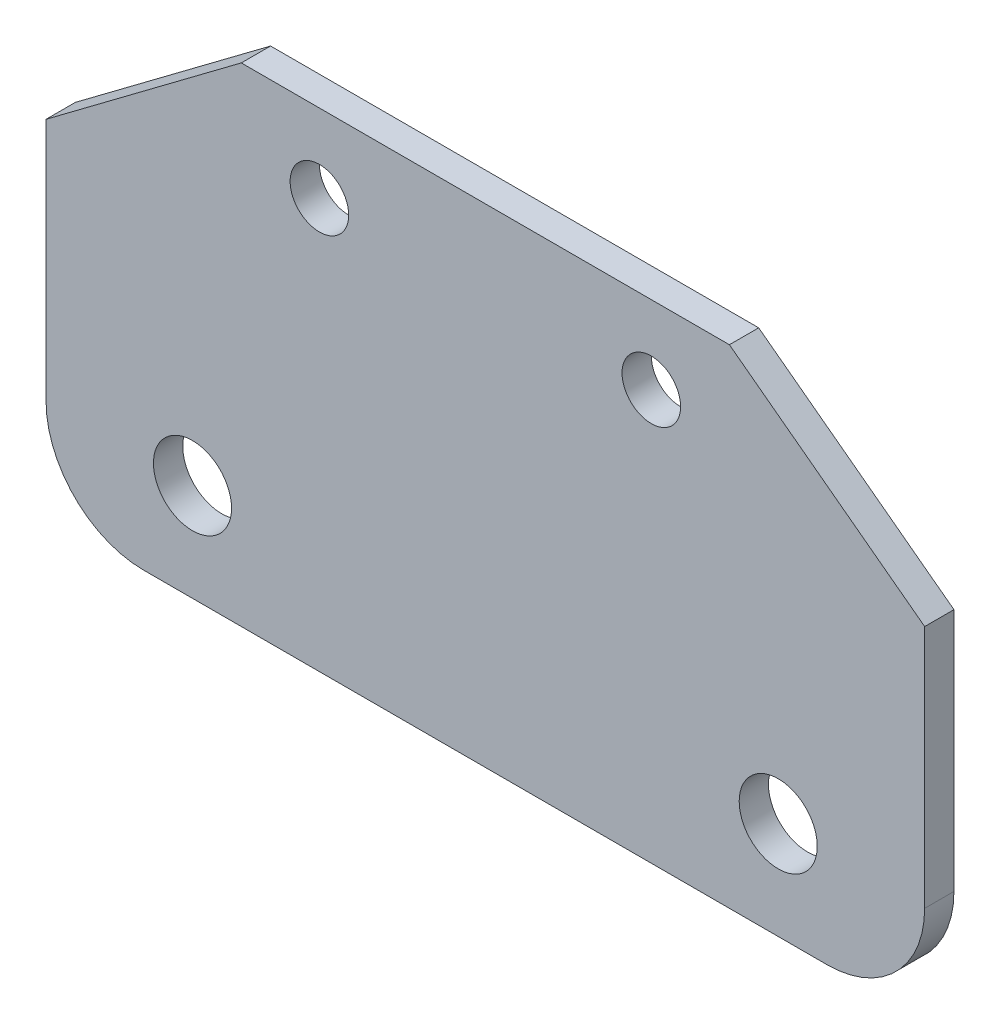
ISO-10303-21;
HEADER;
FILE_DESCRIPTION(('STEP AP214'),'2;1');
FILE_NAME('part.step','',(''),(''),'','','');
FILE_SCHEMA(('AUTOMOTIVE_DESIGN { 1 0 10303 214 1 1 1 1 }'));
ENDSEC;
DATA;
#1=APPLICATION_CONTEXT('core data for automotive mechanical design processes');
#2=APPLICATION_PROTOCOL_DEFINITION('international standard','automotive_design',2000,#1);
#3=PRODUCT_CONTEXT('',#1,'mechanical');
#4=PRODUCT('Part','Part','',(#3));
#5=PRODUCT_RELATED_PRODUCT_CATEGORY('part','',(#4));
#6=PRODUCT_DEFINITION_FORMATION('','',#4);
#7=PRODUCT_DEFINITION_CONTEXT('part definition',#1,'design');
#8=PRODUCT_DEFINITION('design','',#6,#7);
#9=PRODUCT_DEFINITION_SHAPE('','',#8);
#10=(LENGTH_UNIT() NAMED_UNIT(*) SI_UNIT(.MILLI.,.METRE.));
#11=(NAMED_UNIT(*) PLANE_ANGLE_UNIT() SI_UNIT($,.RADIAN.));
#12=(NAMED_UNIT(*) SI_UNIT($,.STERADIAN.) SOLID_ANGLE_UNIT());
#13=UNCERTAINTY_MEASURE_WITH_UNIT(LENGTH_MEASURE(1.E-05),#10,'distance_accuracy_value','');
#14=(GEOMETRIC_REPRESENTATION_CONTEXT(3) GLOBAL_UNCERTAINTY_ASSIGNED_CONTEXT((#13)) GLOBAL_UNIT_ASSIGNED_CONTEXT((#10,
#11,#12)) REPRESENTATION_CONTEXT('',''));
#15=CARTESIAN_POINT('',(0.,0.,0.));
#16=DIRECTION('',(0.,0.,1.));
#17=DIRECTION('',(1.,0.,0.));
#18=AXIS2_PLACEMENT_3D('',#15,#16,#17);
#19=CARTESIAN_POINT('',(0.,0.,3.));
#20=DIRECTION('',(0.,0.,-1.));
#21=DIRECTION('',(-1.,0.,0.));
#22=AXIS2_PLACEMENT_3D('',#19,#20,#21);
#23=PLANE('',#22);
#24=DIRECTION('',(0.,-1.,0.));
#25=VECTOR('',#24,1.);
#26=CARTESIAN_POINT('',(0.,0.,3.));
#27=LINE('',#26,#25);
#28=CARTESIAN_POINT('',(0.,35.,3.));
#29=VERTEX_POINT('',#28);
#30=CARTESIAN_POINT('',(0.,10.,3.));
#31=VERTEX_POINT('',#30);
#32=EDGE_CURVE('E147',#29,#31,#27,.T.);
#33=ORIENTED_EDGE('',*,*,#32,.T.);
#34=CARTESIAN_POINT('',(10.,10.,3.));
#35=DIRECTION('',(0.,0.,-1.));
#36=DIRECTION('',(-1.,0.,0.));
#37=AXIS2_PLACEMENT_3D('',#34,#35,#36);
#38=CIRCLE('',#37,10.);
#39=CARTESIAN_POINT('',(10.,0.,3.));
#40=VERTEX_POINT('',#39);
#41=EDGE_CURVE('E46',#31,#40,#38,.F.);
#42=ORIENTED_EDGE('',*,*,#41,.T.);
#43=DIRECTION('',(1.,0.,0.));
#44=VECTOR('',#43,1.);
#45=CARTESIAN_POINT('',(0.,0.,3.));
#46=LINE('',#45,#44);
#47=CARTESIAN_POINT('',(80.,0.,3.));
#48=VERTEX_POINT('',#47);
#49=EDGE_CURVE('E111',#40,#48,#46,.T.);
#50=ORIENTED_EDGE('',*,*,#49,.T.);
#51=CARTESIAN_POINT('',(80.,10.,3.));
#52=DIRECTION('',(0.,0.,-1.));
#53=DIRECTION('',(-1.,0.,0.));
#54=AXIS2_PLACEMENT_3D('',#51,#52,#53);
#55=CIRCLE('',#54,10.);
#56=CARTESIAN_POINT('',(90.,10.,3.));
#57=VERTEX_POINT('',#56);
#58=EDGE_CURVE('E53',#48,#57,#55,.F.);
#59=ORIENTED_EDGE('',*,*,#58,.T.);
#60=DIRECTION('',(0.,1.,0.));
#61=VECTOR('',#60,1.);
#62=CARTESIAN_POINT('',(90.,0.,3.));
#63=LINE('',#62,#61);
#64=CARTESIAN_POINT('',(90.,35.,3.));
#65=VERTEX_POINT('',#64);
#66=EDGE_CURVE('E103',#57,#65,#63,.T.);
#67=ORIENTED_EDGE('',*,*,#66,.T.);
#68=DIRECTION('',(-0.8,0.6,0.));
#69=VECTOR('',#68,1.);
#70=CARTESIAN_POINT('',(90.,35.,3.));
#71=LINE('',#70,#69);
#72=CARTESIAN_POINT('',(70.,50.,3.));
#73=VERTEX_POINT('',#72);
#74=EDGE_CURVE('E107',#65,#73,#71,.T.);
#75=ORIENTED_EDGE('',*,*,#74,.T.);
#76=DIRECTION('',(-1.,0.,0.));
#77=VECTOR('',#76,1.);
#78=CARTESIAN_POINT('',(20.,50.,3.));
#79=LINE('',#78,#77);
#80=CARTESIAN_POINT('',(20.,50.,3.));
#81=VERTEX_POINT('',#80);
#82=EDGE_CURVE('E126',#73,#81,#79,.T.);
#83=ORIENTED_EDGE('',*,*,#82,.T.);
#84=DIRECTION('',(-0.8,-0.6,0.));
#85=VECTOR('',#84,1.);
#86=CARTESIAN_POINT('',(0.,35.,3.));
#87=LINE('',#86,#85);
#88=EDGE_CURVE('E128',#81,#29,#87,.T.);
#89=ORIENTED_EDGE('',*,*,#88,.T.);
#90=EDGE_LOOP('',(#33,#42,#50,#59,#67,#75,#83,#89));
#91=FACE_BOUND('',#90,.T.);
#92=CARTESIAN_POINT('',(28.,42.,3.));
#93=DIRECTION('',(0.,0.,1.));
#94=DIRECTION('',(1.,0.,0.));
#95=AXIS2_PLACEMENT_3D('',#92,#93,#94);
#96=CIRCLE('',#95,3.);
#97=CARTESIAN_POINT('',(31.,42.,3.));
#98=VERTEX_POINT('',#97);
#99=EDGE_CURVE('E137',#98,#98,#96,.T.);
#100=ORIENTED_EDGE('',*,*,#99,.F.);
#101=EDGE_LOOP('',(#100));
#102=FACE_BOUND('',#101,.T.);
#103=CARTESIAN_POINT('',(15.,10.,3.));
#104=DIRECTION('',(0.,0.,1.));
#105=DIRECTION('',(1.,0.,0.));
#106=AXIS2_PLACEMENT_3D('',#103,#104,#105);
#107=CIRCLE('',#106,4.);
#108=CARTESIAN_POINT('',(19.,10.,3.));
#109=VERTEX_POINT('',#108);
#110=EDGE_CURVE('E238',#109,#109,#107,.T.);
#111=ORIENTED_EDGE('',*,*,#110,.F.);
#112=EDGE_LOOP('',(#111));
#113=FACE_BOUND('',#112,.T.);
#114=CARTESIAN_POINT('',(75.,10.,3.));
#115=DIRECTION('',(0.,0.,1.));
#116=DIRECTION('',(-1.,0.,0.));
#117=AXIS2_PLACEMENT_3D('',#114,#115,#116);
#118=CIRCLE('',#117,4.00000000000001);
#119=CARTESIAN_POINT('',(71.,10.,3.));
#120=VERTEX_POINT('',#119);
#121=EDGE_CURVE('E232',#120,#120,#118,.T.);
#122=ORIENTED_EDGE('',*,*,#121,.F.);
#123=EDGE_LOOP('',(#122));
#124=FACE_BOUND('',#123,.T.);
#125=CARTESIAN_POINT('',(62.,42.,3.));
#126=DIRECTION('',(0.,0.,1.));
#127=DIRECTION('',(-1.,0.,0.));
#128=AXIS2_PLACEMENT_3D('',#125,#126,#127);
#129=CIRCLE('',#128,3.);
#130=CARTESIAN_POINT('',(59.,42.,3.));
#131=VERTEX_POINT('',#130);
#132=EDGE_CURVE('E223',#131,#131,#129,.T.);
#133=ORIENTED_EDGE('',*,*,#132,.F.);
#134=EDGE_LOOP('',(#133));
#135=FACE_BOUND('',#134,.T.);
#136=ADVANCED_FACE('F38',(#91,#102,#113,#124,#135),#23,.F.);
#137=CARTESIAN_POINT('',(0.,0.,0.));
#138=DIRECTION('',(0.,0.,-1.));
#139=DIRECTION('',(-1.,0.,0.));
#140=AXIS2_PLACEMENT_3D('',#137,#138,#139);
#141=PLANE('',#140);
#142=CARTESIAN_POINT('',(75.,10.,0.));
#143=DIRECTION('',(0.,0.,1.));
#144=DIRECTION('',(-1.,0.,0.));
#145=AXIS2_PLACEMENT_3D('',#142,#143,#144);
#146=CIRCLE('',#145,4.00000000000001);
#147=CARTESIAN_POINT('',(71.,10.,0.));
#148=VERTEX_POINT('',#147);
#149=EDGE_CURVE('E229',#148,#148,#146,.T.);
#150=ORIENTED_EDGE('',*,*,#149,.T.);
#151=EDGE_LOOP('',(#150));
#152=FACE_BOUND('',#151,.T.);
#153=CARTESIAN_POINT('',(28.,42.,0.));
#154=DIRECTION('',(0.,0.,1.));
#155=DIRECTION('',(1.,0.,0.));
#156=AXIS2_PLACEMENT_3D('',#153,#154,#155);
#157=CIRCLE('',#156,3.);
#158=CARTESIAN_POINT('',(31.,42.,0.));
#159=VERTEX_POINT('',#158);
#160=EDGE_CURVE('E241',#159,#159,#157,.T.);
#161=ORIENTED_EDGE('',*,*,#160,.T.);
#162=EDGE_LOOP('',(#161));
#163=FACE_BOUND('',#162,.T.);
#164=DIRECTION('',(1.,0.,0.));
#165=VECTOR('',#164,1.);
#166=CARTESIAN_POINT('',(0.,0.,0.));
#167=LINE('',#166,#165);
#168=CARTESIAN_POINT('',(10.,0.,0.));
#169=VERTEX_POINT('',#168);
#170=CARTESIAN_POINT('',(80.,0.,0.));
#171=VERTEX_POINT('',#170);
#172=EDGE_CURVE('E136',#169,#171,#167,.T.);
#173=ORIENTED_EDGE('',*,*,#172,.F.);
#174=CARTESIAN_POINT('',(10.,10.,0.));
#175=DIRECTION('',(0.,0.,-1.));
#176=DIRECTION('',(-1.,0.,0.));
#177=AXIS2_PLACEMENT_3D('',#174,#175,#176);
#178=CIRCLE('',#177,10.);
#179=CARTESIAN_POINT('',(0.,10.,0.));
#180=VERTEX_POINT('',#179);
#181=EDGE_CURVE('E160',#169,#180,#178,.T.);
#182=ORIENTED_EDGE('',*,*,#181,.T.);
#183=DIRECTION('',(0.,-1.,0.));
#184=VECTOR('',#183,1.);
#185=CARTESIAN_POINT('',(0.,0.,0.));
#186=LINE('',#185,#184);
#187=CARTESIAN_POINT('',(0.,35.,0.));
#188=VERTEX_POINT('',#187);
#189=EDGE_CURVE('E134',#188,#180,#186,.T.);
#190=ORIENTED_EDGE('',*,*,#189,.F.);
#191=DIRECTION('',(-0.8,-0.6,0.));
#192=VECTOR('',#191,1.);
#193=CARTESIAN_POINT('',(0.,35.,0.));
#194=LINE('',#193,#192);
#195=CARTESIAN_POINT('',(20.,50.,0.));
#196=VERTEX_POINT('',#195);
#197=EDGE_CURVE('E145',#196,#188,#194,.T.);
#198=ORIENTED_EDGE('',*,*,#197,.F.);
#199=DIRECTION('',(-1.,0.,0.));
#200=VECTOR('',#199,1.);
#201=CARTESIAN_POINT('',(20.,50.,0.));
#202=LINE('',#201,#200);
#203=CARTESIAN_POINT('',(70.,50.,0.));
#204=VERTEX_POINT('',#203);
#205=EDGE_CURVE('E143',#204,#196,#202,.T.);
#206=ORIENTED_EDGE('',*,*,#205,.F.);
#207=DIRECTION('',(-0.8,0.6,0.));
#208=VECTOR('',#207,1.);
#209=CARTESIAN_POINT('',(90.,35.,0.));
#210=LINE('',#209,#208);
#211=CARTESIAN_POINT('',(90.,35.,0.));
#212=VERTEX_POINT('',#211);
#213=EDGE_CURVE('E141',#212,#204,#210,.T.);
#214=ORIENTED_EDGE('',*,*,#213,.F.);
#215=DIRECTION('',(0.,1.,0.));
#216=VECTOR('',#215,1.);
#217=CARTESIAN_POINT('',(90.,0.,0.));
#218=LINE('',#217,#216);
#219=CARTESIAN_POINT('',(90.,10.,0.));
#220=VERTEX_POINT('',#219);
#221=EDGE_CURVE('E117',#220,#212,#218,.T.);
#222=ORIENTED_EDGE('',*,*,#221,.F.);
#223=CARTESIAN_POINT('',(80.,10.,0.));
#224=DIRECTION('',(0.,0.,-1.));
#225=DIRECTION('',(-1.,0.,0.));
#226=AXIS2_PLACEMENT_3D('',#223,#224,#225);
#227=CIRCLE('',#226,10.);
#228=EDGE_CURVE('E158',#220,#171,#227,.T.);
#229=ORIENTED_EDGE('',*,*,#228,.T.);
#230=EDGE_LOOP('',(#173,#182,#190,#198,#206,#214,#222,#229));
#231=FACE_BOUND('',#230,.T.);
#232=CARTESIAN_POINT('',(15.,10.,0.));
#233=DIRECTION('',(0.,0.,1.));
#234=DIRECTION('',(1.,0.,0.));
#235=AXIS2_PLACEMENT_3D('',#232,#233,#234);
#236=CIRCLE('',#235,4.);
#237=CARTESIAN_POINT('',(19.,10.,0.));
#238=VERTEX_POINT('',#237);
#239=EDGE_CURVE('E235',#238,#238,#236,.T.);
#240=ORIENTED_EDGE('',*,*,#239,.T.);
#241=EDGE_LOOP('',(#240));
#242=FACE_BOUND('',#241,.T.);
#243=CARTESIAN_POINT('',(62.,42.,0.));
#244=DIRECTION('',(0.,0.,1.));
#245=DIRECTION('',(-1.,0.,0.));
#246=AXIS2_PLACEMENT_3D('',#243,#244,#245);
#247=CIRCLE('',#246,3.);
#248=CARTESIAN_POINT('',(59.,42.,0.));
#249=VERTEX_POINT('',#248);
#250=EDGE_CURVE('E226',#249,#249,#247,.T.);
#251=ORIENTED_EDGE('',*,*,#250,.T.);
#252=EDGE_LOOP('',(#251));
#253=FACE_BOUND('',#252,.T.);
#254=ADVANCED_FACE('F174',(#152,#163,#231,#242,#253),#141,.T.);
#255=CARTESIAN_POINT('',(0.,0.,3.));
#256=DIRECTION('',(1.,0.,0.));
#257=DIRECTION('',(0.,0.,-1.));
#258=AXIS2_PLACEMENT_3D('',#255,#256,#257);
#259=PLANE('',#258);
#260=ORIENTED_EDGE('',*,*,#189,.T.);
#261=DIRECTION('',(0.,0.,-1.));
#262=VECTOR('',#261,1.);
#263=CARTESIAN_POINT('',(0.,10.,3.));
#264=LINE('',#263,#262);
#265=EDGE_CURVE('E61',#180,#31,#264,.F.);
#266=ORIENTED_EDGE('',*,*,#265,.T.);
#267=ORIENTED_EDGE('',*,*,#32,.F.);
#268=DIRECTION('',(0.,0.,-1.));
#269=VECTOR('',#268,1.);
#270=CARTESIAN_POINT('',(0.,35.,3.));
#271=LINE('',#270,#269);
#272=EDGE_CURVE('E133',#29,#188,#271,.T.);
#273=ORIENTED_EDGE('',*,*,#272,.T.);
#274=EDGE_LOOP('',(#260,#266,#267,#273));
#275=FACE_BOUND('',#274,.T.);
#276=ADVANCED_FACE('F177',(#275),#259,.F.);
#277=CARTESIAN_POINT('',(0.,0.,3.));
#278=DIRECTION('',(0.,1.,0.));
#279=DIRECTION('',(-1.,0.,0.));
#280=AXIS2_PLACEMENT_3D('',#277,#278,#279);
#281=PLANE('',#280);
#282=ORIENTED_EDGE('',*,*,#49,.F.);
#283=DIRECTION('',(0.,0.,-1.));
#284=VECTOR('',#283,1.);
#285=CARTESIAN_POINT('',(10.,0.,3.));
#286=LINE('',#285,#284);
#287=EDGE_CURVE('E155',#40,#169,#286,.T.);
#288=ORIENTED_EDGE('',*,*,#287,.T.);
#289=ORIENTED_EDGE('',*,*,#172,.T.);
#290=DIRECTION('',(0.,0.,-1.));
#291=VECTOR('',#290,1.);
#292=CARTESIAN_POINT('',(80.,0.,3.));
#293=LINE('',#292,#291);
#294=EDGE_CURVE('E120',#171,#48,#293,.F.);
#295=ORIENTED_EDGE('',*,*,#294,.T.);
#296=EDGE_LOOP('',(#282,#288,#289,#295));
#297=FACE_BOUND('',#296,.T.);
#298=ADVANCED_FACE('F168',(#297),#281,.F.);
#299=CARTESIAN_POINT('',(90.,0.,3.));
#300=DIRECTION('',(-1.,0.,0.));
#301=DIRECTION('',(0.,-1.,0.));
#302=AXIS2_PLACEMENT_3D('',#299,#300,#301);
#303=PLANE('',#302);
#304=ORIENTED_EDGE('',*,*,#66,.F.);
#305=DIRECTION('',(0.,0.,-1.));
#306=VECTOR('',#305,1.);
#307=CARTESIAN_POINT('',(90.,10.,3.));
#308=LINE('',#307,#306);
#309=EDGE_CURVE('E11',#57,#220,#308,.T.);
#310=ORIENTED_EDGE('',*,*,#309,.T.);
#311=ORIENTED_EDGE('',*,*,#221,.T.);
#312=DIRECTION('',(0.,0.,-1.));
#313=VECTOR('',#312,1.);
#314=CARTESIAN_POINT('',(90.,35.,3.));
#315=LINE('',#314,#313);
#316=EDGE_CURVE('E114',#65,#212,#315,.T.);
#317=ORIENTED_EDGE('',*,*,#316,.F.);
#318=EDGE_LOOP('',(#304,#310,#311,#317));
#319=FACE_BOUND('',#318,.T.);
#320=ADVANCED_FACE('F115',(#319),#303,.F.);
#321=CARTESIAN_POINT('',(90.,35.,3.));
#322=DIRECTION('',(-0.6,-0.8,0.));
#323=DIRECTION('',(0.8,-0.6,0.));
#324=AXIS2_PLACEMENT_3D('',#321,#322,#323);
#325=PLANE('',#324);
#326=ORIENTED_EDGE('',*,*,#213,.T.);
#327=DIRECTION('',(0.,0.,-1.));
#328=VECTOR('',#327,1.);
#329=CARTESIAN_POINT('',(70.,50.,3.));
#330=LINE('',#329,#328);
#331=EDGE_CURVE('E121',#73,#204,#330,.T.);
#332=ORIENTED_EDGE('',*,*,#331,.F.);
#333=ORIENTED_EDGE('',*,*,#74,.F.);
#334=ORIENTED_EDGE('',*,*,#316,.T.);
#335=EDGE_LOOP('',(#326,#332,#333,#334));
#336=FACE_BOUND('',#335,.T.);
#337=ADVANCED_FACE('F123',(#336),#325,.F.);
#338=CARTESIAN_POINT('',(20.,50.,3.));
#339=DIRECTION('',(0.,-1.,0.));
#340=DIRECTION('',(1.,0.,0.));
#341=AXIS2_PLACEMENT_3D('',#338,#339,#340);
#342=PLANE('',#341);
#343=ORIENTED_EDGE('',*,*,#205,.T.);
#344=DIRECTION('',(0.,0.,-1.));
#345=VECTOR('',#344,1.);
#346=CARTESIAN_POINT('',(20.,50.,3.));
#347=LINE('',#346,#345);
#348=EDGE_CURVE('E150',#81,#196,#347,.T.);
#349=ORIENTED_EDGE('',*,*,#348,.F.);
#350=ORIENTED_EDGE('',*,*,#82,.F.);
#351=ORIENTED_EDGE('',*,*,#331,.T.);
#352=EDGE_LOOP('',(#343,#349,#350,#351));
#353=FACE_BOUND('',#352,.T.);
#354=ADVANCED_FACE('F185',(#353),#342,.F.);
#355=CARTESIAN_POINT('',(0.,35.,3.));
#356=DIRECTION('',(0.6,-0.8,0.));
#357=DIRECTION('',(0.8,0.6,0.));
#358=AXIS2_PLACEMENT_3D('',#355,#356,#357);
#359=PLANE('',#358);
#360=ORIENTED_EDGE('',*,*,#197,.T.);
#361=ORIENTED_EDGE('',*,*,#272,.F.);
#362=ORIENTED_EDGE('',*,*,#88,.F.);
#363=ORIENTED_EDGE('',*,*,#348,.T.);
#364=EDGE_LOOP('',(#360,#361,#362,#363));
#365=FACE_BOUND('',#364,.T.);
#366=ADVANCED_FACE('F181',(#365),#359,.F.);
#367=CARTESIAN_POINT('',(28.,42.,3.));
#368=DIRECTION('',(0.,0.,-1.));
#369=DIRECTION('',(-1.,0.,0.));
#370=AXIS2_PLACEMENT_3D('',#367,#368,#369);
#371=CYLINDRICAL_SURFACE('',#370,3.);
#372=ORIENTED_EDGE('',*,*,#99,.T.);
#373=EDGE_LOOP('',(#372));
#374=FACE_BOUND('',#373,.T.);
#375=ORIENTED_EDGE('',*,*,#160,.F.);
#376=EDGE_LOOP('',(#375));
#377=FACE_BOUND('',#376,.T.);
#378=ADVANCED_FACE('F192',(#374,#377),#371,.F.);
#379=CARTESIAN_POINT('',(15.,10.,3.));
#380=DIRECTION('',(0.,0.,-1.));
#381=DIRECTION('',(-1.,0.,0.));
#382=AXIS2_PLACEMENT_3D('',#379,#380,#381);
#383=CYLINDRICAL_SURFACE('',#382,4.);
#384=ORIENTED_EDGE('',*,*,#110,.T.);
#385=EDGE_LOOP('',(#384));
#386=FACE_BOUND('',#385,.T.);
#387=ORIENTED_EDGE('',*,*,#239,.F.);
#388=EDGE_LOOP('',(#387));
#389=FACE_BOUND('',#388,.T.);
#390=ADVANCED_FACE('F205',(#386,#389),#383,.F.);
#391=CARTESIAN_POINT('',(75.,10.,3.));
#392=DIRECTION('',(0.,0.,-1.));
#393=DIRECTION('',(-1.,0.,0.));
#394=AXIS2_PLACEMENT_3D('',#391,#392,#393);
#395=CYLINDRICAL_SURFACE('',#394,4.00000000000001);
#396=ORIENTED_EDGE('',*,*,#121,.T.);
#397=EDGE_LOOP('',(#396));
#398=FACE_BOUND('',#397,.T.);
#399=ORIENTED_EDGE('',*,*,#149,.F.);
#400=EDGE_LOOP('',(#399));
#401=FACE_BOUND('',#400,.T.);
#402=ADVANCED_FACE('F209',(#398,#401),#395,.F.);
#403=CARTESIAN_POINT('',(62.,42.,3.));
#404=DIRECTION('',(0.,0.,-1.));
#405=DIRECTION('',(-1.,0.,0.));
#406=AXIS2_PLACEMENT_3D('',#403,#404,#405);
#407=CYLINDRICAL_SURFACE('',#406,3.);
#408=ORIENTED_EDGE('',*,*,#132,.T.);
#409=EDGE_LOOP('',(#408));
#410=FACE_BOUND('',#409,.T.);
#411=ORIENTED_EDGE('',*,*,#250,.F.);
#412=EDGE_LOOP('',(#411));
#413=FACE_BOUND('',#412,.T.);
#414=ADVANCED_FACE('F213',(#410,#413),#407,.F.);
#415=CARTESIAN_POINT('',(10.,10.,3.));
#416=DIRECTION('',(0.,0.,-1.));
#417=DIRECTION('',(-1.,0.,0.));
#418=AXIS2_PLACEMENT_3D('',#415,#416,#417);
#419=CYLINDRICAL_SURFACE('',#418,10.);
#420=ORIENTED_EDGE('',*,*,#41,.F.);
#421=ORIENTED_EDGE('',*,*,#265,.F.);
#422=ORIENTED_EDGE('',*,*,#181,.F.);
#423=ORIENTED_EDGE('',*,*,#287,.F.);
#424=EDGE_LOOP('',(#420,#421,#422,#423));
#425=FACE_BOUND('',#424,.T.);
#426=ADVANCED_FACE('F171',(#425),#419,.T.);
#427=CARTESIAN_POINT('',(80.,10.,3.));
#428=DIRECTION('',(0.,0.,-1.));
#429=DIRECTION('',(-1.,0.,0.));
#430=AXIS2_PLACEMENT_3D('',#427,#428,#429);
#431=CYLINDRICAL_SURFACE('',#430,10.);
#432=ORIENTED_EDGE('',*,*,#58,.F.);
#433=ORIENTED_EDGE('',*,*,#294,.F.);
#434=ORIENTED_EDGE('',*,*,#228,.F.);
#435=ORIENTED_EDGE('',*,*,#309,.F.);
#436=EDGE_LOOP('',(#432,#433,#434,#435));
#437=FACE_BOUND('',#436,.T.);
#438=ADVANCED_FACE('F40',(#437),#431,.T.);
#439=CLOSED_SHELL('',(#136,#254,#276,#298,#320,#337,#354,#366,#378,#390,#402,#414,#426,#438));
#440=MANIFOLD_SOLID_BREP('B2',#439);
#441=ADVANCED_BREP_SHAPE_REPRESENTATION('',(#18,#440),#14);
#442=SHAPE_DEFINITION_REPRESENTATION(#9,#441);
ENDSEC;
END-ISO-10303-21;
